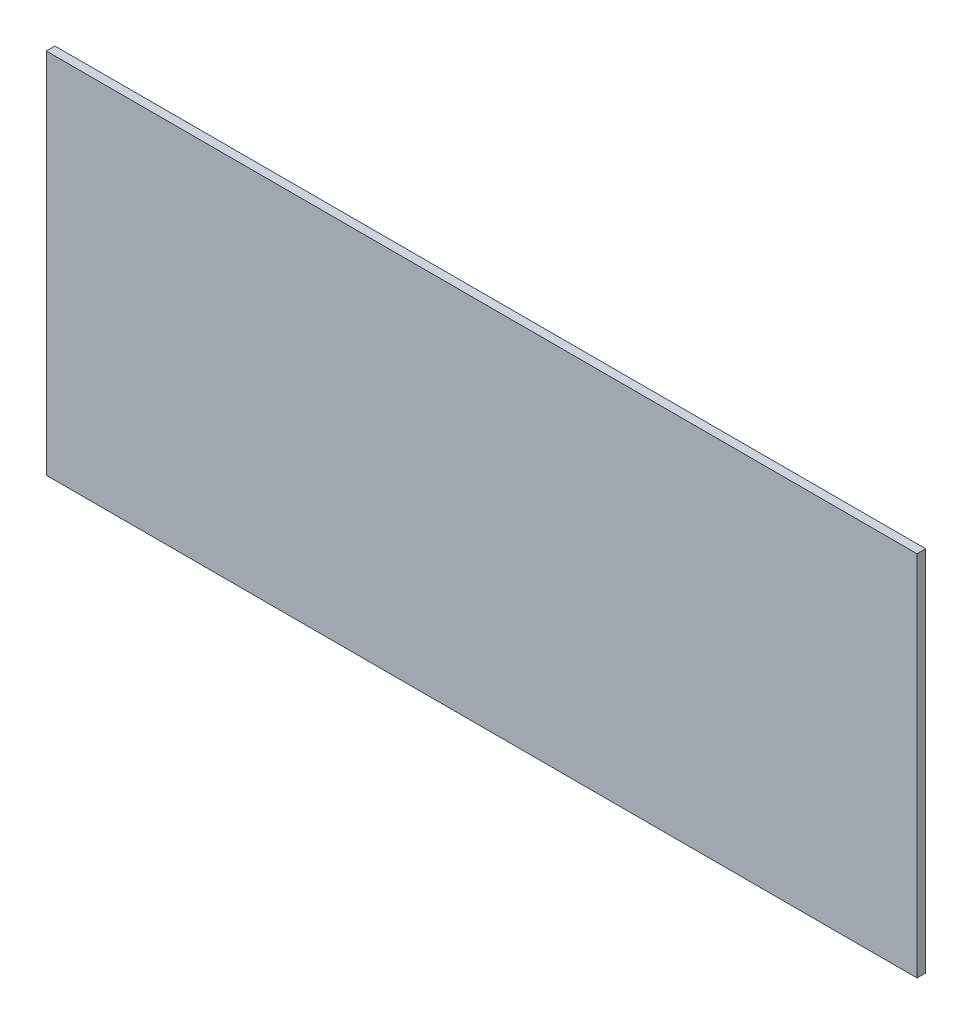
ISO-10303-21;
HEADER;
FILE_DESCRIPTION(('STEP AP214'),'2;1');
FILE_NAME('part.step','',(''),(''),'','','');
FILE_SCHEMA(('AUTOMOTIVE_DESIGN { 1 0 10303 214 1 1 1 1 }'));
ENDSEC;
DATA;
#1=APPLICATION_CONTEXT('core data for automotive mechanical design processes');
#2=APPLICATION_PROTOCOL_DEFINITION('international standard','automotive_design',2000,#1);
#3=PRODUCT_CONTEXT('',#1,'mechanical');
#4=PRODUCT('Part','Part','',(#3));
#5=PRODUCT_RELATED_PRODUCT_CATEGORY('part','',(#4));
#6=PRODUCT_DEFINITION_FORMATION('','',#4);
#7=PRODUCT_DEFINITION_CONTEXT('part definition',#1,'design');
#8=PRODUCT_DEFINITION('design','',#6,#7);
#9=PRODUCT_DEFINITION_SHAPE('','',#8);
#10=(LENGTH_UNIT() NAMED_UNIT(*) SI_UNIT(.MILLI.,.METRE.));
#11=(NAMED_UNIT(*) PLANE_ANGLE_UNIT() SI_UNIT($,.RADIAN.));
#12=(NAMED_UNIT(*) SI_UNIT($,.STERADIAN.) SOLID_ANGLE_UNIT());
#13=UNCERTAINTY_MEASURE_WITH_UNIT(LENGTH_MEASURE(1.E-05),#10,'distance_accuracy_value','');
#14=(GEOMETRIC_REPRESENTATION_CONTEXT(3) GLOBAL_UNCERTAINTY_ASSIGNED_CONTEXT((#13)) GLOBAL_UNIT_ASSIGNED_CONTEXT((#10,
#11,#12)) REPRESENTATION_CONTEXT('',''));
#15=CARTESIAN_POINT('',(0.,0.,0.));
#16=DIRECTION('',(0.,0.,1.));
#17=DIRECTION('',(1.,0.,0.));
#18=AXIS2_PLACEMENT_3D('',#15,#16,#17);
#19=CARTESIAN_POINT('',(0.,0.,3.));
#20=DIRECTION('',(-1.,0.,0.));
#21=DIRECTION('',(0.,-1.,0.));
#22=AXIS2_PLACEMENT_3D('',#19,#20,#21);
#23=PLANE('',#22);
#24=DIRECTION('',(0.,1.,0.));
#25=VECTOR('',#24,1.);
#26=CARTESIAN_POINT('',(0.,0.,0.));
#27=LINE('',#26,#25);
#28=CARTESIAN_POINT('',(0.,0.,0.));
#29=VERTEX_POINT('',#28);
#30=CARTESIAN_POINT('',(0.,127.,0.));
#31=VERTEX_POINT('',#30);
#32=EDGE_CURVE('E96',#29,#31,#27,.T.);
#33=ORIENTED_EDGE('',*,*,#32,.T.);
#34=DIRECTION('',(0.,0.,-1.));
#35=VECTOR('',#34,1.);
#36=CARTESIAN_POINT('',(0.,127.,3.));
#37=LINE('',#36,#35);
#38=CARTESIAN_POINT('',(0.,127.,3.));
#39=VERTEX_POINT('',#38);
#40=EDGE_CURVE('E11',#39,#31,#37,.T.);
#41=ORIENTED_EDGE('',*,*,#40,.F.);
#42=DIRECTION('',(0.,1.,0.));
#43=VECTOR('',#42,1.);
#44=CARTESIAN_POINT('',(0.,0.,3.));
#45=LINE('',#44,#43);
#46=CARTESIAN_POINT('',(0.,0.,3.));
#47=VERTEX_POINT('',#46);
#48=EDGE_CURVE('E84',#47,#39,#45,.T.);
#49=ORIENTED_EDGE('',*,*,#48,.F.);
#50=DIRECTION('',(0.,0.,-1.));
#51=VECTOR('',#50,1.);
#52=CARTESIAN_POINT('',(0.,0.,3.));
#53=LINE('',#52,#51);
#54=EDGE_CURVE('E92',#47,#29,#53,.T.);
#55=ORIENTED_EDGE('',*,*,#54,.T.);
#56=EDGE_LOOP('',(#33,#41,#49,#55));
#57=FACE_BOUND('',#56,.T.);
#58=ADVANCED_FACE('F33',(#57),#23,.F.);
#59=CARTESIAN_POINT('',(0.,127.,3.));
#60=DIRECTION('',(0.,-1.,0.));
#61=DIRECTION('',(1.,0.,0.));
#62=AXIS2_PLACEMENT_3D('',#59,#60,#61);
#63=PLANE('',#62);
#64=DIRECTION('',(-1.,0.,0.));
#65=VECTOR('',#64,1.);
#66=CARTESIAN_POINT('',(0.,127.,0.));
#67=LINE('',#66,#65);
#68=CARTESIAN_POINT('',(-301.,127.,0.));
#69=VERTEX_POINT('',#68);
#70=EDGE_CURVE('E88',#31,#69,#67,.T.);
#71=ORIENTED_EDGE('',*,*,#70,.T.);
#72=DIRECTION('',(0.,0.,-1.));
#73=VECTOR('',#72,1.);
#74=CARTESIAN_POINT('',(-301.,127.,3.));
#75=LINE('',#74,#73);
#76=CARTESIAN_POINT('',(-301.,127.,3.));
#77=VERTEX_POINT('',#76);
#78=EDGE_CURVE('E41',#77,#69,#75,.T.);
#79=ORIENTED_EDGE('',*,*,#78,.F.);
#80=DIRECTION('',(-1.,0.,0.));
#81=VECTOR('',#80,1.);
#82=CARTESIAN_POINT('',(0.,127.,3.));
#83=LINE('',#82,#81);
#84=EDGE_CURVE('E79',#39,#77,#83,.T.);
#85=ORIENTED_EDGE('',*,*,#84,.F.);
#86=ORIENTED_EDGE('',*,*,#40,.T.);
#87=EDGE_LOOP('',(#71,#79,#85,#86));
#88=FACE_BOUND('',#87,.T.);
#89=ADVANCED_FACE('F87',(#88),#63,.F.);
#90=CARTESIAN_POINT('',(-301.,0.,3.));
#91=DIRECTION('',(1.,0.,0.));
#92=DIRECTION('',(0.,0.,-1.));
#93=AXIS2_PLACEMENT_3D('',#90,#91,#92);
#94=PLANE('',#93);
#95=DIRECTION('',(0.,-1.,0.));
#96=VECTOR('',#95,1.);
#97=CARTESIAN_POINT('',(-301.,0.,0.));
#98=LINE('',#97,#96);
#99=CARTESIAN_POINT('',(-301.,0.,0.));
#100=VERTEX_POINT('',#99);
#101=EDGE_CURVE('E66',#69,#100,#98,.T.);
#102=ORIENTED_EDGE('',*,*,#101,.T.);
#103=DIRECTION('',(0.,0.,-1.));
#104=VECTOR('',#103,1.);
#105=CARTESIAN_POINT('',(-301.,0.,3.));
#106=LINE('',#105,#104);
#107=CARTESIAN_POINT('',(-301.,0.,3.));
#108=VERTEX_POINT('',#107);
#109=EDGE_CURVE('E89',#108,#100,#106,.T.);
#110=ORIENTED_EDGE('',*,*,#109,.F.);
#111=DIRECTION('',(0.,-1.,0.));
#112=VECTOR('',#111,1.);
#113=CARTESIAN_POINT('',(-301.,0.,3.));
#114=LINE('',#113,#112);
#115=EDGE_CURVE('E82',#77,#108,#114,.T.);
#116=ORIENTED_EDGE('',*,*,#115,.F.);
#117=ORIENTED_EDGE('',*,*,#78,.T.);
#118=EDGE_LOOP('',(#102,#110,#116,#117));
#119=FACE_BOUND('',#118,.T.);
#120=ADVANCED_FACE('F90',(#119),#94,.F.);
#121=CARTESIAN_POINT('',(0.,0.,3.));
#122=DIRECTION('',(0.,1.,0.));
#123=DIRECTION('',(-1.,0.,0.));
#124=AXIS2_PLACEMENT_3D('',#121,#122,#123);
#125=PLANE('',#124);
#126=DIRECTION('',(1.,0.,0.));
#127=VECTOR('',#126,1.);
#128=CARTESIAN_POINT('',(0.,0.,0.));
#129=LINE('',#128,#127);
#130=EDGE_CURVE('E72',#100,#29,#129,.T.);
#131=ORIENTED_EDGE('',*,*,#130,.T.);
#132=ORIENTED_EDGE('',*,*,#54,.F.);
#133=DIRECTION('',(1.,0.,0.));
#134=VECTOR('',#133,1.);
#135=CARTESIAN_POINT('',(0.,0.,3.));
#136=LINE('',#135,#134);
#137=EDGE_CURVE('E49',#108,#47,#136,.T.);
#138=ORIENTED_EDGE('',*,*,#137,.F.);
#139=ORIENTED_EDGE('',*,*,#109,.T.);
#140=EDGE_LOOP('',(#131,#132,#138,#139));
#141=FACE_BOUND('',#140,.T.);
#142=ADVANCED_FACE('F103',(#141),#125,.F.);
#143=CARTESIAN_POINT('',(0.,0.,3.));
#144=DIRECTION('',(0.,0.,1.));
#145=DIRECTION('',(1.,0.,0.));
#146=AXIS2_PLACEMENT_3D('',#143,#144,#145);
#147=PLANE('',#146);
#148=ORIENTED_EDGE('',*,*,#48,.T.);
#149=ORIENTED_EDGE('',*,*,#84,.T.);
#150=ORIENTED_EDGE('',*,*,#115,.T.);
#151=ORIENTED_EDGE('',*,*,#137,.T.);
#152=EDGE_LOOP('',(#148,#149,#150,#151));
#153=FACE_BOUND('',#152,.T.);
#154=ADVANCED_FACE('F80',(#153),#147,.T.);
#155=CARTESIAN_POINT('',(0.,0.,0.));
#156=DIRECTION('',(0.,0.,1.));
#157=DIRECTION('',(1.,0.,0.));
#158=AXIS2_PLACEMENT_3D('',#155,#156,#157);
#159=PLANE('',#158);
#160=ORIENTED_EDGE('',*,*,#32,.F.);
#161=ORIENTED_EDGE('',*,*,#130,.F.);
#162=ORIENTED_EDGE('',*,*,#101,.F.);
#163=ORIENTED_EDGE('',*,*,#70,.F.);
#164=EDGE_LOOP('',(#160,#161,#162,#163));
#165=FACE_BOUND('',#164,.T.);
#166=ADVANCED_FACE('F106',(#165),#159,.F.);
#167=CLOSED_SHELL('',(#58,#89,#120,#142,#154,#166));
#168=MANIFOLD_SOLID_BREP('B2',#167);
#169=ADVANCED_BREP_SHAPE_REPRESENTATION('',(#18,#168),#14);
#170=SHAPE_DEFINITION_REPRESENTATION(#9,#169);
ENDSEC;
END-ISO-10303-21;
